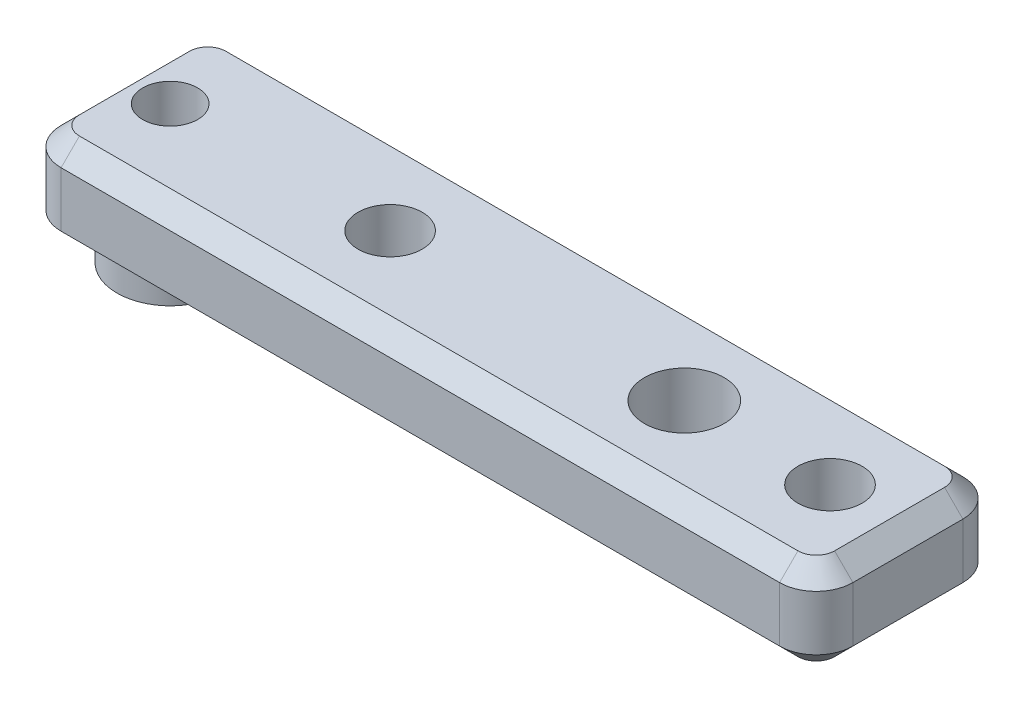
ISO-10303-21;
HEADER;
FILE_DESCRIPTION(('STEP AP214'),'2;1');
FILE_NAME('part.step','',(''),(''),'','','');
FILE_SCHEMA(('AUTOMOTIVE_DESIGN { 1 0 10303 214 1 1 1 1 }'));
ENDSEC;
DATA;
#1=APPLICATION_CONTEXT('core data for automotive mechanical design processes');
#2=APPLICATION_PROTOCOL_DEFINITION('international standard','automotive_design',2000,#1);
#3=PRODUCT_CONTEXT('',#1,'mechanical');
#4=PRODUCT('Part','Part','',(#3));
#5=PRODUCT_RELATED_PRODUCT_CATEGORY('part','',(#4));
#6=PRODUCT_DEFINITION_FORMATION('','',#4);
#7=PRODUCT_DEFINITION_CONTEXT('part definition',#1,'design');
#8=PRODUCT_DEFINITION('design','',#6,#7);
#9=PRODUCT_DEFINITION_SHAPE('','',#8);
#10=(LENGTH_UNIT() NAMED_UNIT(*) SI_UNIT(.MILLI.,.METRE.));
#11=(NAMED_UNIT(*) PLANE_ANGLE_UNIT() SI_UNIT($,.RADIAN.));
#12=(NAMED_UNIT(*) SI_UNIT($,.STERADIAN.) SOLID_ANGLE_UNIT());
#13=UNCERTAINTY_MEASURE_WITH_UNIT(LENGTH_MEASURE(1.E-05),#10,'distance_accuracy_value','');
#14=(GEOMETRIC_REPRESENTATION_CONTEXT(3) GLOBAL_UNCERTAINTY_ASSIGNED_CONTEXT((#13)) GLOBAL_UNIT_ASSIGNED_CONTEXT((#10,
#11,#12)) REPRESENTATION_CONTEXT('',''));
#15=CARTESIAN_POINT('',(0.,0.,0.));
#16=DIRECTION('',(0.,0.,1.));
#17=DIRECTION('',(1.,0.,0.));
#18=AXIS2_PLACEMENT_3D('',#15,#16,#17);
#19=CARTESIAN_POINT('',(-27.,5.,-5.));
#20=DIRECTION('',(0.,0.,1.));
#21=DIRECTION('',(1.,0.,0.));
#22=AXIS2_PLACEMENT_3D('',#19,#20,#21);
#23=PLANE('',#22);
#24=DIRECTION('',(0.,1.,0.));
#25=VECTOR('',#24,1.);
#26=CARTESIAN_POINT('',(14.2,5.,-5.));
#27=LINE('',#26,#25);
#28=CARTESIAN_POINT('',(14.2,4.,-5.));
#29=VERTEX_POINT('',#28);
#30=CARTESIAN_POINT('',(14.2,1.00000000000001,-5.));
#31=VERTEX_POINT('',#30);
#32=EDGE_CURVE('E187',#29,#31,#27,.F.);
#33=ORIENTED_EDGE('',*,*,#32,.T.);
#34=DIRECTION('',(-1.,0.,0.));
#35=VECTOR('',#34,1.);
#36=CARTESIAN_POINT('',(-27.,1.00000000000001,-5.));
#37=LINE('',#36,#35);
#38=CARTESIAN_POINT('',(-25.,1.00000000000001,-5.));
#39=VERTEX_POINT('',#38);
#40=EDGE_CURVE('E188',#31,#39,#37,.T.);
#41=ORIENTED_EDGE('',*,*,#40,.T.);
#42=DIRECTION('',(0.,-1.,0.));
#43=VECTOR('',#42,1.);
#44=CARTESIAN_POINT('',(-25.,5.,-5.));
#45=LINE('',#44,#43);
#46=CARTESIAN_POINT('',(-25.,4.,-5.));
#47=VERTEX_POINT('',#46);
#48=EDGE_CURVE('E186',#39,#47,#45,.F.);
#49=ORIENTED_EDGE('',*,*,#48,.T.);
#50=DIRECTION('',(1.,0.,0.));
#51=VECTOR('',#50,1.);
#52=CARTESIAN_POINT('',(14.2,4.,-5.));
#53=LINE('',#52,#51);
#54=EDGE_CURVE('E168',#47,#29,#53,.T.);
#55=ORIENTED_EDGE('',*,*,#54,.T.);
#56=EDGE_LOOP('',(#33,#41,#49,#55));
#57=FACE_BOUND('',#56,.T.);
#58=ADVANCED_FACE('F41',(#57),#23,.F.);
#59=CARTESIAN_POINT('',(-27.,5.,-5.));
#60=DIRECTION('',(1.,0.,0.));
#61=DIRECTION('',(0.,0.,-1.));
#62=AXIS2_PLACEMENT_3D('',#59,#60,#61);
#63=PLANE('',#62);
#64=DIRECTION('',(0.,-1.,0.));
#65=VECTOR('',#64,1.);
#66=CARTESIAN_POINT('',(-27.,5.,-3.));
#67=LINE('',#66,#65);
#68=CARTESIAN_POINT('',(-27.,4.,-3.));
#69=VERTEX_POINT('',#68);
#70=CARTESIAN_POINT('',(-27.,1.00000000000001,-3.));
#71=VERTEX_POINT('',#70);
#72=EDGE_CURVE('E324',#69,#71,#67,.T.);
#73=ORIENTED_EDGE('',*,*,#72,.T.);
#74=DIRECTION('',(0.,0.,1.));
#75=VECTOR('',#74,1.);
#76=CARTESIAN_POINT('',(-27.,1.00000000000001,-5.));
#77=LINE('',#76,#75);
#78=CARTESIAN_POINT('',(-27.,1.00000000000001,3.));
#79=VERTEX_POINT('',#78);
#80=EDGE_CURVE('E230',#71,#79,#77,.T.);
#81=ORIENTED_EDGE('',*,*,#80,.T.);
#82=DIRECTION('',(0.,-1.,0.));
#83=VECTOR('',#82,1.);
#84=CARTESIAN_POINT('',(-27.,5.,3.));
#85=LINE('',#84,#83);
#86=CARTESIAN_POINT('',(-27.,4.,3.));
#87=VERTEX_POINT('',#86);
#88=EDGE_CURVE('E329',#79,#87,#85,.F.);
#89=ORIENTED_EDGE('',*,*,#88,.T.);
#90=DIRECTION('',(0.,0.,-1.));
#91=VECTOR('',#90,1.);
#92=CARTESIAN_POINT('',(-27.,4.,-3.));
#93=LINE('',#92,#91);
#94=EDGE_CURVE('E227',#87,#69,#93,.T.);
#95=ORIENTED_EDGE('',*,*,#94,.T.);
#96=EDGE_LOOP('',(#73,#81,#89,#95));
#97=FACE_BOUND('',#96,.T.);
#98=ADVANCED_FACE('F403',(#97),#63,.F.);
#99=CARTESIAN_POINT('',(-27.,5.,5.));
#100=DIRECTION('',(0.,0.,-1.));
#101=DIRECTION('',(-1.,0.,0.));
#102=AXIS2_PLACEMENT_3D('',#99,#100,#101);
#103=PLANE('',#102);
#104=DIRECTION('',(0.,-1.,0.));
#105=VECTOR('',#104,1.);
#106=CARTESIAN_POINT('',(-25.,5.,5.));
#107=LINE('',#106,#105);
#108=CARTESIAN_POINT('',(-25.,4.,5.));
#109=VERTEX_POINT('',#108);
#110=CARTESIAN_POINT('',(-25.,1.00000000000001,5.));
#111=VERTEX_POINT('',#110);
#112=EDGE_CURVE('E312',#109,#111,#107,.T.);
#113=ORIENTED_EDGE('',*,*,#112,.T.);
#114=DIRECTION('',(1.,0.,0.));
#115=VECTOR('',#114,1.);
#116=CARTESIAN_POINT('',(-27.,1.00000000000001,5.));
#117=LINE('',#116,#115);
#118=CARTESIAN_POINT('',(14.2,1.00000000000001,5.));
#119=VERTEX_POINT('',#118);
#120=EDGE_CURVE('E244',#111,#119,#117,.T.);
#121=ORIENTED_EDGE('',*,*,#120,.T.);
#122=DIRECTION('',(0.,1.,0.));
#123=VECTOR('',#122,1.);
#124=CARTESIAN_POINT('',(14.2,5.,5.));
#125=LINE('',#124,#123);
#126=CARTESIAN_POINT('',(14.2,4.,5.));
#127=VERTEX_POINT('',#126);
#128=EDGE_CURVE('E193',#119,#127,#125,.T.);
#129=ORIENTED_EDGE('',*,*,#128,.T.);
#130=DIRECTION('',(-1.,0.,0.));
#131=VECTOR('',#130,1.);
#132=CARTESIAN_POINT('',(-25.,4.,5.));
#133=LINE('',#132,#131);
#134=EDGE_CURVE('E243',#127,#109,#133,.T.);
#135=ORIENTED_EDGE('',*,*,#134,.T.);
#136=EDGE_LOOP('',(#113,#121,#129,#135));
#137=FACE_BOUND('',#136,.T.);
#138=ADVANCED_FACE('F315',(#137),#103,.F.);
#139=CARTESIAN_POINT('',(0.,5.,0.));
#140=DIRECTION('',(0.,1.,0.));
#141=DIRECTION('',(0.,0.,1.));
#142=AXIS2_PLACEMENT_3D('',#139,#140,#141);
#143=PLANE('',#142);
#144=CARTESIAN_POINT('',(14.2,5.,-3.));
#145=DIRECTION('',(0.,1.,0.));
#146=DIRECTION('',(0.,0.,1.));
#147=AXIS2_PLACEMENT_3D('',#144,#145,#146);
#148=CIRCLE('',#147,0.999999999999999);
#149=CARTESIAN_POINT('',(15.2,5.,-3.));
#150=VERTEX_POINT('',#149);
#151=CARTESIAN_POINT('',(14.2,5.,-4.));
#152=VERTEX_POINT('',#151);
#153=EDGE_CURVE('E69',#150,#152,#148,.T.);
#154=ORIENTED_EDGE('',*,*,#153,.T.);
#155=DIRECTION('',(-1.,0.,0.));
#156=VECTOR('',#155,1.);
#157=CARTESIAN_POINT('',(-25.,5.,-4.));
#158=LINE('',#157,#156);
#159=CARTESIAN_POINT('',(-25.,5.,-4.));
#160=VERTEX_POINT('',#159);
#161=EDGE_CURVE('E51',#152,#160,#158,.T.);
#162=ORIENTED_EDGE('',*,*,#161,.T.);
#163=CARTESIAN_POINT('',(-25.,5.,-3.));
#164=DIRECTION('',(0.,1.,0.));
#165=DIRECTION('',(0.,0.,1.));
#166=AXIS2_PLACEMENT_3D('',#163,#164,#165);
#167=CIRCLE('',#166,0.999999999999997);
#168=CARTESIAN_POINT('',(-26.,5.,-3.));
#169=VERTEX_POINT('',#168);
#170=EDGE_CURVE('E257',#160,#169,#167,.T.);
#171=ORIENTED_EDGE('',*,*,#170,.T.);
#172=DIRECTION('',(0.,0.,1.));
#173=VECTOR('',#172,1.);
#174=CARTESIAN_POINT('',(-26.,5.,3.));
#175=LINE('',#174,#173);
#176=CARTESIAN_POINT('',(-26.,5.,3.));
#177=VERTEX_POINT('',#176);
#178=EDGE_CURVE('E253',#169,#177,#175,.T.);
#179=ORIENTED_EDGE('',*,*,#178,.T.);
#180=CARTESIAN_POINT('',(-25.,5.,3.));
#181=DIRECTION('',(0.,1.,0.));
#182=DIRECTION('',(0.,0.,1.));
#183=AXIS2_PLACEMENT_3D('',#180,#181,#182);
#184=CIRCLE('',#183,0.999999999999997);
#185=CARTESIAN_POINT('',(-25.,5.,4.));
#186=VERTEX_POINT('',#185);
#187=EDGE_CURVE('E252',#177,#186,#184,.T.);
#188=ORIENTED_EDGE('',*,*,#187,.T.);
#189=DIRECTION('',(1.,0.,0.));
#190=VECTOR('',#189,1.);
#191=CARTESIAN_POINT('',(14.2,5.,4.));
#192=LINE('',#191,#190);
#193=CARTESIAN_POINT('',(14.2,5.,4.));
#194=VERTEX_POINT('',#193);
#195=EDGE_CURVE('E250',#186,#194,#192,.T.);
#196=ORIENTED_EDGE('',*,*,#195,.T.);
#197=CARTESIAN_POINT('',(14.2,5.,3.));
#198=DIRECTION('',(0.,1.,0.));
#199=DIRECTION('',(0.,0.,1.));
#200=AXIS2_PLACEMENT_3D('',#197,#198,#199);
#201=CIRCLE('',#200,0.999999999999999);
#202=CARTESIAN_POINT('',(15.2,5.,3.));
#203=VERTEX_POINT('',#202);
#204=EDGE_CURVE('E248',#194,#203,#201,.T.);
#205=ORIENTED_EDGE('',*,*,#204,.T.);
#206=DIRECTION('',(0.,0.,-1.));
#207=VECTOR('',#206,1.);
#208=CARTESIAN_POINT('',(15.2,5.,-3.));
#209=LINE('',#208,#207);
#210=EDGE_CURVE('E254',#203,#150,#209,.T.);
#211=ORIENTED_EDGE('',*,*,#210,.T.);
#212=EDGE_LOOP('',(#154,#162,#171,#179,#188,#196,#205,#211));
#213=FACE_BOUND('',#212,.T.);
#214=CARTESIAN_POINT('',(-24.05,5.,0.));
#215=DIRECTION('',(0.,1.,0.));
#216=DIRECTION('',(0.,0.,1.));
#217=AXIS2_PLACEMENT_3D('',#214,#215,#216);
#218=CIRCLE('',#217,1.5);
#219=CARTESIAN_POINT('',(-24.05,5.,1.5));
#220=VERTEX_POINT('',#219);
#221=EDGE_CURVE('E369',#220,#220,#218,.T.);
#222=ORIENTED_EDGE('',*,*,#221,.F.);
#223=EDGE_LOOP('',(#222));
#224=FACE_BOUND('',#223,.T.);
#225=CARTESIAN_POINT('',(4.,5.,0.));
#226=DIRECTION('',(0.,1.,0.));
#227=DIRECTION('',(0.,0.,1.));
#228=AXIS2_PLACEMENT_3D('',#225,#226,#227);
#229=CIRCLE('',#228,2.175);
#230=CARTESIAN_POINT('',(4.,5.,2.175));
#231=VERTEX_POINT('',#230);
#232=EDGE_CURVE('E377',#231,#231,#229,.T.);
#233=ORIENTED_EDGE('',*,*,#232,.F.);
#234=EDGE_LOOP('',(#233));
#235=FACE_BOUND('',#234,.T.);
#236=CARTESIAN_POINT('',(-12.05,5.,0.));
#237=DIRECTION('',(0.,1.,0.));
#238=DIRECTION('',(0.,0.,1.));
#239=AXIS2_PLACEMENT_3D('',#236,#237,#238);
#240=CIRCLE('',#239,1.75);
#241=CARTESIAN_POINT('',(-12.05,5.,1.75));
#242=VERTEX_POINT('',#241);
#243=EDGE_CURVE('E372',#242,#242,#240,.T.);
#244=ORIENTED_EDGE('',*,*,#243,.F.);
#245=EDGE_LOOP('',(#244));
#246=FACE_BOUND('',#245,.T.);
#247=CARTESIAN_POINT('',(11.95,5.,0.));
#248=DIRECTION('',(0.,1.,0.));
#249=DIRECTION('',(0.,0.,1.));
#250=AXIS2_PLACEMENT_3D('',#247,#248,#249);
#251=CIRCLE('',#250,1.75);
#252=CARTESIAN_POINT('',(11.95,5.,1.75));
#253=VERTEX_POINT('',#252);
#254=EDGE_CURVE('E371',#253,#253,#251,.T.);
#255=ORIENTED_EDGE('',*,*,#254,.F.);
#256=EDGE_LOOP('',(#255));
#257=FACE_BOUND('',#256,.T.);
#258=ADVANCED_FACE('F600',(#213,#224,#235,#246,#257),#143,.T.);
#259=CARTESIAN_POINT('',(0.,0.,0.));
#260=DIRECTION('',(0.,1.,0.));
#261=DIRECTION('',(0.,0.,1.));
#262=AXIS2_PLACEMENT_3D('',#259,#260,#261);
#263=PLANE('',#262);
#264=CARTESIAN_POINT('',(-24.05,0.,0.));
#265=DIRECTION('',(0.,-1.,0.));
#266=DIRECTION('',(0.,0.,-1.));
#267=AXIS2_PLACEMENT_3D('',#264,#265,#266);
#268=CIRCLE('',#267,2.9);
#269=CARTESIAN_POINT('',(-26.,0.,-2.14650879336658));
#270=VERTEX_POINT('',#269);
#271=CARTESIAN_POINT('',(-26.,0.,2.14650879336658));
#272=VERTEX_POINT('',#271);
#273=EDGE_CURVE('E323',#270,#272,#268,.T.);
#274=ORIENTED_EDGE('',*,*,#273,.F.);
#275=DIRECTION('',(0.,0.,-1.));
#276=VECTOR('',#275,1.);
#277=CARTESIAN_POINT('',(-26.,0.,0.));
#278=LINE('',#277,#276);
#279=CARTESIAN_POINT('',(-26.,0.,-3.));
#280=VERTEX_POINT('',#279);
#281=EDGE_CURVE('E223',#270,#280,#278,.T.);
#282=ORIENTED_EDGE('',*,*,#281,.T.);
#283=CARTESIAN_POINT('',(-25.,0.,-3.));
#284=DIRECTION('',(0.,1.,0.));
#285=DIRECTION('',(0.,0.,1.));
#286=AXIS2_PLACEMENT_3D('',#283,#284,#285);
#287=CIRCLE('',#286,0.999999999999992);
#288=CARTESIAN_POINT('',(-25.,0.,-3.99999999999999));
#289=VERTEX_POINT('',#288);
#290=EDGE_CURVE('E220',#280,#289,#287,.F.);
#291=ORIENTED_EDGE('',*,*,#290,.T.);
#292=DIRECTION('',(1.,0.,0.));
#293=VECTOR('',#292,1.);
#294=CARTESIAN_POINT('',(0.,0.,-3.99999999999999));
#295=LINE('',#294,#293);
#296=CARTESIAN_POINT('',(14.2,0.,-3.99999999999999));
#297=VERTEX_POINT('',#296);
#298=EDGE_CURVE('E218',#289,#297,#295,.T.);
#299=ORIENTED_EDGE('',*,*,#298,.T.);
#300=CARTESIAN_POINT('',(14.2,0.,-3.));
#301=DIRECTION('',(0.,1.,0.));
#302=DIRECTION('',(0.,0.,1.));
#303=AXIS2_PLACEMENT_3D('',#300,#301,#302);
#304=CIRCLE('',#303,0.999999999999992);
#305=CARTESIAN_POINT('',(15.2,0.,-3.));
#306=VERTEX_POINT('',#305);
#307=EDGE_CURVE('E215',#297,#306,#304,.F.);
#308=ORIENTED_EDGE('',*,*,#307,.T.);
#309=DIRECTION('',(0.,0.,1.));
#310=VECTOR('',#309,1.);
#311=CARTESIAN_POINT('',(15.2,0.,0.));
#312=LINE('',#311,#310);
#313=CARTESIAN_POINT('',(15.2,0.,3.));
#314=VERTEX_POINT('',#313);
#315=EDGE_CURVE('E208',#306,#314,#312,.T.);
#316=ORIENTED_EDGE('',*,*,#315,.T.);
#317=CARTESIAN_POINT('',(14.2,0.,3.));
#318=DIRECTION('',(0.,1.,0.));
#319=DIRECTION('',(0.,0.,1.));
#320=AXIS2_PLACEMENT_3D('',#317,#318,#319);
#321=CIRCLE('',#320,0.999999999999992);
#322=CARTESIAN_POINT('',(14.2,0.,3.99999999999999));
#323=VERTEX_POINT('',#322);
#324=EDGE_CURVE('E207',#314,#323,#321,.F.);
#325=ORIENTED_EDGE('',*,*,#324,.T.);
#326=DIRECTION('',(-1.,0.,0.));
#327=VECTOR('',#326,1.);
#328=CARTESIAN_POINT('',(0.,0.,3.99999999999999));
#329=LINE('',#328,#327);
#330=CARTESIAN_POINT('',(-25.,0.,3.99999999999999));
#331=VERTEX_POINT('',#330);
#332=EDGE_CURVE('E204',#323,#331,#329,.T.);
#333=ORIENTED_EDGE('',*,*,#332,.T.);
#334=CARTESIAN_POINT('',(-25.,0.,3.));
#335=DIRECTION('',(0.,1.,0.));
#336=DIRECTION('',(0.,0.,1.));
#337=AXIS2_PLACEMENT_3D('',#334,#335,#336);
#338=CIRCLE('',#337,0.99999999999999);
#339=CARTESIAN_POINT('',(-26.,0.,3.));
#340=VERTEX_POINT('',#339);
#341=EDGE_CURVE('E206',#331,#340,#338,.F.);
#342=ORIENTED_EDGE('',*,*,#341,.T.);
#343=DIRECTION('',(0.,0.,-1.));
#344=VECTOR('',#343,1.);
#345=CARTESIAN_POINT('',(-26.,0.,0.));
#346=LINE('',#345,#344);
#347=EDGE_CURVE('E214',#340,#272,#346,.T.);
#348=ORIENTED_EDGE('',*,*,#347,.T.);
#349=EDGE_LOOP('',(#274,#282,#291,#299,#308,#316,#325,#333,#342,#348));
#350=FACE_BOUND('',#349,.T.);
#351=CARTESIAN_POINT('',(4.,0.,0.));
#352=DIRECTION('',(0.,1.,0.));
#353=DIRECTION('',(0.,0.,1.));
#354=AXIS2_PLACEMENT_3D('',#351,#352,#353);
#355=CIRCLE('',#354,2.175);
#356=CARTESIAN_POINT('',(4.,0.,2.175));
#357=VERTEX_POINT('',#356);
#358=EDGE_CURVE('E360',#357,#357,#355,.T.);
#359=ORIENTED_EDGE('',*,*,#358,.T.);
#360=EDGE_LOOP('',(#359));
#361=FACE_BOUND('',#360,.T.);
#362=CARTESIAN_POINT('',(-12.05,0.,0.));
#363=DIRECTION('',(0.,1.,0.));
#364=DIRECTION('',(0.,0.,1.));
#365=AXIS2_PLACEMENT_3D('',#362,#363,#364);
#366=CIRCLE('',#365,1.75);
#367=CARTESIAN_POINT('',(-12.05,0.,1.75));
#368=VERTEX_POINT('',#367);
#369=EDGE_CURVE('E365',#368,#368,#366,.T.);
#370=ORIENTED_EDGE('',*,*,#369,.T.);
#371=EDGE_LOOP('',(#370));
#372=FACE_BOUND('',#371,.T.);
#373=CARTESIAN_POINT('',(11.95,0.,0.));
#374=DIRECTION('',(0.,1.,0.));
#375=DIRECTION('',(0.,0.,1.));
#376=AXIS2_PLACEMENT_3D('',#373,#374,#375);
#377=CIRCLE('',#376,1.75);
#378=CARTESIAN_POINT('',(11.95,0.,1.75));
#379=VERTEX_POINT('',#378);
#380=EDGE_CURVE('E370',#379,#379,#377,.T.);
#381=ORIENTED_EDGE('',*,*,#380,.T.);
#382=EDGE_LOOP('',(#381));
#383=FACE_BOUND('',#382,.T.);
#384=ADVANCED_FACE('F595',(#350,#361,#372,#383),#263,.F.);
#385=CARTESIAN_POINT('',(11.95,-2.,0.));
#386=DIRECTION('',(0.,1.,0.));
#387=DIRECTION('',(0.,0.,1.));
#388=AXIS2_PLACEMENT_3D('',#385,#386,#387);
#389=CYLINDRICAL_SURFACE('',#388,1.75);
#390=ORIENTED_EDGE('',*,*,#254,.T.);
#391=EDGE_LOOP('',(#390));
#392=FACE_BOUND('',#391,.T.);
#393=ORIENTED_EDGE('',*,*,#380,.F.);
#394=EDGE_LOOP('',(#393));
#395=FACE_BOUND('',#394,.T.);
#396=ADVANCED_FACE('F597',(#392,#395),#389,.F.);
#397=CARTESIAN_POINT('',(-12.05,-2.,0.));
#398=DIRECTION('',(0.,1.,0.));
#399=DIRECTION('',(0.,0.,1.));
#400=AXIS2_PLACEMENT_3D('',#397,#398,#399);
#401=CYLINDRICAL_SURFACE('',#400,1.75);
#402=ORIENTED_EDGE('',*,*,#243,.T.);
#403=EDGE_LOOP('',(#402));
#404=FACE_BOUND('',#403,.T.);
#405=ORIENTED_EDGE('',*,*,#369,.F.);
#406=EDGE_LOOP('',(#405));
#407=FACE_BOUND('',#406,.T.);
#408=ADVANCED_FACE('F627',(#404,#407),#401,.F.);
#409=CARTESIAN_POINT('',(4.,-2.,0.));
#410=DIRECTION('',(0.,1.,0.));
#411=DIRECTION('',(0.,0.,1.));
#412=AXIS2_PLACEMENT_3D('',#409,#410,#411);
#413=CYLINDRICAL_SURFACE('',#412,2.175);
#414=ORIENTED_EDGE('',*,*,#232,.T.);
#415=EDGE_LOOP('',(#414));
#416=FACE_BOUND('',#415,.T.);
#417=ORIENTED_EDGE('',*,*,#358,.F.);
#418=EDGE_LOOP('',(#417));
#419=FACE_BOUND('',#418,.T.);
#420=ADVANCED_FACE('F637',(#416,#419),#413,.F.);
#421=CARTESIAN_POINT('',(-24.05,-2.,0.));
#422=DIRECTION('',(0.,1.,0.));
#423=DIRECTION('',(0.,0.,1.));
#424=AXIS2_PLACEMENT_3D('',#421,#422,#423);
#425=CYLINDRICAL_SURFACE('',#424,1.5);
#426=ORIENTED_EDGE('',*,*,#221,.T.);
#427=EDGE_LOOP('',(#426));
#428=FACE_BOUND('',#427,.T.);
#429=CARTESIAN_POINT('',(-24.05,-2.5,0.));
#430=DIRECTION('',(0.,-1.,0.));
#431=DIRECTION('',(0.,0.,-1.));
#432=AXIS2_PLACEMENT_3D('',#429,#430,#431);
#433=CIRCLE('',#432,1.5);
#434=CARTESIAN_POINT('',(-24.05,-2.5,-1.5));
#435=VERTEX_POINT('',#434);
#436=EDGE_CURVE('E282',#435,#435,#433,.T.);
#437=ORIENTED_EDGE('',*,*,#436,.T.);
#438=EDGE_LOOP('',(#437));
#439=FACE_BOUND('',#438,.T.);
#440=ADVANCED_FACE('F387',(#428,#439),#425,.F.);
#441=CARTESIAN_POINT('',(-25.,5.,-3.));
#442=DIRECTION('',(0.,-1.,0.));
#443=DIRECTION('',(0.,0.,-1.));
#444=AXIS2_PLACEMENT_3D('',#441,#442,#443);
#445=CYLINDRICAL_SURFACE('',#444,2.);
#446=ORIENTED_EDGE('',*,*,#48,.F.);
#447=CARTESIAN_POINT('',(-25.,1.00000000000001,-3.));
#448=DIRECTION('',(0.,1.,0.));
#449=DIRECTION('',(0.,0.,1.));
#450=AXIS2_PLACEMENT_3D('',#447,#448,#449);
#451=CIRCLE('',#450,2.);
#452=EDGE_CURVE('E179',#39,#71,#451,.T.);
#453=ORIENTED_EDGE('',*,*,#452,.T.);
#454=ORIENTED_EDGE('',*,*,#72,.F.);
#455=CARTESIAN_POINT('',(-25.,4.,-3.));
#456=DIRECTION('',(0.,1.,0.));
#457=DIRECTION('',(0.,0.,1.));
#458=AXIS2_PLACEMENT_3D('',#455,#456,#457);
#459=CIRCLE('',#458,2.);
#460=EDGE_CURVE('E221',#69,#47,#459,.F.);
#461=ORIENTED_EDGE('',*,*,#460,.T.);
#462=EDGE_LOOP('',(#446,#453,#454,#461));
#463=FACE_BOUND('',#462,.T.);
#464=ADVANCED_FACE('F358',(#463),#445,.T.);
#465=CARTESIAN_POINT('',(-25.,5.,3.));
#466=DIRECTION('',(0.,-1.,0.));
#467=DIRECTION('',(0.,0.,-1.));
#468=AXIS2_PLACEMENT_3D('',#465,#466,#467);
#469=CYLINDRICAL_SURFACE('',#468,2.);
#470=ORIENTED_EDGE('',*,*,#88,.F.);
#471=CARTESIAN_POINT('',(-25.,1.00000000000001,3.));
#472=DIRECTION('',(0.,1.,0.));
#473=DIRECTION('',(0.,0.,1.));
#474=AXIS2_PLACEMENT_3D('',#471,#472,#473);
#475=CIRCLE('',#474,2.);
#476=EDGE_CURVE('E240',#79,#111,#475,.T.);
#477=ORIENTED_EDGE('',*,*,#476,.T.);
#478=ORIENTED_EDGE('',*,*,#112,.F.);
#479=CARTESIAN_POINT('',(-25.,4.,3.));
#480=DIRECTION('',(0.,1.,0.));
#481=DIRECTION('',(0.,0.,1.));
#482=AXIS2_PLACEMENT_3D('',#479,#480,#481);
#483=CIRCLE('',#482,2.);
#484=EDGE_CURVE('E232',#109,#87,#483,.F.);
#485=ORIENTED_EDGE('',*,*,#484,.T.);
#486=EDGE_LOOP('',(#470,#477,#478,#485));
#487=FACE_BOUND('',#486,.T.);
#488=ADVANCED_FACE('F319',(#487),#469,.T.);
#489=CARTESIAN_POINT('',(-24.05,-2.5,0.));
#490=DIRECTION('',(0.,-1.,0.));
#491=DIRECTION('',(0.,0.,-1.));
#492=AXIS2_PLACEMENT_3D('',#489,#490,#491);
#493=PLANE('',#492);
#494=CARTESIAN_POINT('',(-24.05,-2.5,0.));
#495=DIRECTION('',(0.,-1.,0.));
#496=DIRECTION('',(0.,0.,-1.));
#497=AXIS2_PLACEMENT_3D('',#494,#495,#496);
#498=CIRCLE('',#497,2.9);
#499=CARTESIAN_POINT('',(-24.05,-2.5,-2.9));
#500=VERTEX_POINT('',#499);
#501=EDGE_CURVE('E374',#500,#500,#498,.T.);
#502=ORIENTED_EDGE('',*,*,#501,.T.);
#503=EDGE_LOOP('',(#502));
#504=FACE_BOUND('',#503,.T.);
#505=ORIENTED_EDGE('',*,*,#436,.F.);
#506=EDGE_LOOP('',(#505));
#507=FACE_BOUND('',#506,.T.);
#508=ADVANCED_FACE('F386',(#504,#507),#493,.T.);
#509=CARTESIAN_POINT('',(-24.05,-2.5,0.));
#510=DIRECTION('',(0.,1.,0.));
#511=DIRECTION('',(0.,0.,1.));
#512=AXIS2_PLACEMENT_3D('',#509,#510,#511);
#513=CYLINDRICAL_SURFACE('',#512,2.9);
#514=ORIENTED_EDGE('',*,*,#501,.F.);
#515=EDGE_LOOP('',(#514));
#516=FACE_BOUND('',#515,.T.);
#517=ORIENTED_EDGE('',*,*,#273,.T.);
#518=CARTESIAN_POINT('',(-24.05,-1.94999999999998,0.));
#519=DIRECTION('',(0.707106781186547,0.707106781186547,0.));
#520=DIRECTION('',(-0.707106781186548,0.707106781186548,0.));
#521=AXIS2_PLACEMENT_3D('',#518,#519,#520);
#522=ELLIPSE('',#521,4.10121933088198,2.9);
#523=EDGE_CURVE('E11',#272,#270,#522,.F.);
#524=ORIENTED_EDGE('',*,*,#523,.T.);
#525=EDGE_LOOP('',(#517,#524));
#526=FACE_BOUND('',#525,.T.);
#527=ADVANCED_FACE('F394',(#516,#526),#513,.T.);
#528=CARTESIAN_POINT('',(16.2,-5.,-5.));
#529=DIRECTION('',(-1.,0.,0.));
#530=DIRECTION('',(0.,0.,1.));
#531=AXIS2_PLACEMENT_3D('',#528,#529,#530);
#532=PLANE('',#531);
#533=DIRECTION('',(0.,1.,0.));
#534=VECTOR('',#533,1.);
#535=CARTESIAN_POINT('',(16.2,-5.,3.));
#536=LINE('',#535,#534);
#537=CARTESIAN_POINT('',(16.2,4.,3.));
#538=VERTEX_POINT('',#537);
#539=CARTESIAN_POINT('',(16.2,1.00000000000001,3.));
#540=VERTEX_POINT('',#539);
#541=EDGE_CURVE('E200',#538,#540,#536,.F.);
#542=ORIENTED_EDGE('',*,*,#541,.T.);
#543=DIRECTION('',(0.,0.,-1.));
#544=VECTOR('',#543,1.);
#545=CARTESIAN_POINT('',(16.2,1.00000000000001,-5.));
#546=LINE('',#545,#544);
#547=CARTESIAN_POINT('',(16.2,1.00000000000001,-3.));
#548=VERTEX_POINT('',#547);
#549=EDGE_CURVE('E231',#540,#548,#546,.T.);
#550=ORIENTED_EDGE('',*,*,#549,.T.);
#551=DIRECTION('',(0.,1.,0.));
#552=VECTOR('',#551,1.);
#553=CARTESIAN_POINT('',(16.2,-5.,-3.));
#554=LINE('',#553,#552);
#555=CARTESIAN_POINT('',(16.2,4.,-3.));
#556=VERTEX_POINT('',#555);
#557=EDGE_CURVE('E191',#548,#556,#554,.T.);
#558=ORIENTED_EDGE('',*,*,#557,.T.);
#559=DIRECTION('',(0.,0.,1.));
#560=VECTOR('',#559,1.);
#561=CARTESIAN_POINT('',(16.2,4.,3.));
#562=LINE('',#561,#560);
#563=EDGE_CURVE('E233',#556,#538,#562,.T.);
#564=ORIENTED_EDGE('',*,*,#563,.T.);
#565=EDGE_LOOP('',(#542,#550,#558,#564));
#566=FACE_BOUND('',#565,.T.);
#567=ADVANCED_FACE('F334',(#566),#532,.F.);
#568=CARTESIAN_POINT('',(14.2,-5.,-3.));
#569=DIRECTION('',(0.,1.,0.));
#570=DIRECTION('',(0.,0.,1.));
#571=AXIS2_PLACEMENT_3D('',#568,#569,#570);
#572=CYLINDRICAL_SURFACE('',#571,2.);
#573=ORIENTED_EDGE('',*,*,#557,.F.);
#574=CARTESIAN_POINT('',(14.2,1.00000000000001,-3.));
#575=DIRECTION('',(0.,1.,0.));
#576=DIRECTION('',(0.,0.,1.));
#577=AXIS2_PLACEMENT_3D('',#574,#575,#576);
#578=CIRCLE('',#577,2.);
#579=EDGE_CURVE('E177',#548,#31,#578,.T.);
#580=ORIENTED_EDGE('',*,*,#579,.T.);
#581=ORIENTED_EDGE('',*,*,#32,.F.);
#582=CARTESIAN_POINT('',(14.2,4.,-3.));
#583=DIRECTION('',(0.,1.,0.));
#584=DIRECTION('',(0.,0.,1.));
#585=AXIS2_PLACEMENT_3D('',#582,#583,#584);
#586=CIRCLE('',#585,2.);
#587=EDGE_CURVE('E171',#29,#556,#586,.F.);
#588=ORIENTED_EDGE('',*,*,#587,.T.);
#589=EDGE_LOOP('',(#573,#580,#581,#588));
#590=FACE_BOUND('',#589,.T.);
#591=ADVANCED_FACE('F192',(#590),#572,.T.);
#592=CARTESIAN_POINT('',(14.2,5.,3.));
#593=DIRECTION('',(0.,1.,0.));
#594=DIRECTION('',(0.,0.,1.));
#595=AXIS2_PLACEMENT_3D('',#592,#593,#594);
#596=CYLINDRICAL_SURFACE('',#595,2.);
#597=ORIENTED_EDGE('',*,*,#128,.F.);
#598=CARTESIAN_POINT('',(14.2,1.00000000000001,3.));
#599=DIRECTION('',(0.,1.,0.));
#600=DIRECTION('',(0.,0.,1.));
#601=AXIS2_PLACEMENT_3D('',#598,#599,#600);
#602=CIRCLE('',#601,2.);
#603=EDGE_CURVE('E241',#119,#540,#602,.T.);
#604=ORIENTED_EDGE('',*,*,#603,.T.);
#605=ORIENTED_EDGE('',*,*,#541,.F.);
#606=CARTESIAN_POINT('',(14.2,4.,3.));
#607=DIRECTION('',(0.,1.,0.));
#608=DIRECTION('',(0.,0.,1.));
#609=AXIS2_PLACEMENT_3D('',#606,#607,#608);
#610=CIRCLE('',#609,2.);
#611=EDGE_CURVE('E237',#538,#127,#610,.F.);
#612=ORIENTED_EDGE('',*,*,#611,.T.);
#613=EDGE_LOOP('',(#597,#604,#605,#612));
#614=FACE_BOUND('',#613,.T.);
#615=ADVANCED_FACE('F416',(#614),#596,.T.);
#616=CARTESIAN_POINT('',(-27.,1.00000000000001,5.));
#617=DIRECTION('',(0.,0.707106781186547,-0.707106781186547));
#618=DIRECTION('',(1.,0.,0.));
#619=AXIS2_PLACEMENT_3D('',#616,#617,#618);
#620=PLANE('',#619);
#621=DIRECTION('',(0.,0.707106781186547,0.707106781186547));
#622=VECTOR('',#621,1.);
#623=CARTESIAN_POINT('',(-25.,0.,3.99999999999999));
#624=LINE('',#623,#622);
#625=EDGE_CURVE('E279',#331,#111,#624,.T.);
#626=ORIENTED_EDGE('',*,*,#625,.F.);
#627=ORIENTED_EDGE('',*,*,#332,.F.);
#628=DIRECTION('',(0.,-0.707106781186547,-0.707106781186547));
#629=VECTOR('',#628,1.);
#630=CARTESIAN_POINT('',(14.2,1.00000000000001,5.));
#631=LINE('',#630,#629);
#632=EDGE_CURVE('E276',#119,#323,#631,.T.);
#633=ORIENTED_EDGE('',*,*,#632,.F.);
#634=ORIENTED_EDGE('',*,*,#120,.F.);
#635=EDGE_LOOP('',(#626,#627,#633,#634));
#636=FACE_BOUND('',#635,.T.);
#637=ADVANCED_FACE('F423',(#636),#620,.F.);
#638=CARTESIAN_POINT('',(14.2,0.,3.));
#639=DIRECTION('',(0.,1.,0.));
#640=DIRECTION('',(0.,0.,1.));
#641=AXIS2_PLACEMENT_3D('',#638,#639,#640);
#642=CONICAL_SURFACE('',#641,0.999999999999992,0.785398163397448);
#643=ORIENTED_EDGE('',*,*,#632,.T.);
#644=ORIENTED_EDGE('',*,*,#324,.F.);
#645=DIRECTION('',(-0.707106781186547,-0.707106781186548,0.));
#646=VECTOR('',#645,1.);
#647=CARTESIAN_POINT('',(16.2,1.00000000000001,3.));
#648=LINE('',#647,#646);
#649=EDGE_CURVE('E274',#540,#314,#648,.T.);
#650=ORIENTED_EDGE('',*,*,#649,.F.);
#651=ORIENTED_EDGE('',*,*,#603,.F.);
#652=EDGE_LOOP('',(#643,#644,#650,#651));
#653=FACE_BOUND('',#652,.T.);
#654=ADVANCED_FACE('F343',(#653),#642,.T.);
#655=CARTESIAN_POINT('',(-25.,0.,3.));
#656=DIRECTION('',(0.,1.,0.));
#657=DIRECTION('',(0.,0.,1.));
#658=AXIS2_PLACEMENT_3D('',#655,#656,#657);
#659=CONICAL_SURFACE('',#658,0.99999999999999,0.785398163397449);
#660=ORIENTED_EDGE('',*,*,#625,.T.);
#661=ORIENTED_EDGE('',*,*,#476,.F.);
#662=DIRECTION('',(-0.707106781186547,0.707106781186547,0.));
#663=VECTOR('',#662,1.);
#664=CARTESIAN_POINT('',(-26.,0.,3.));
#665=LINE('',#664,#663);
#666=EDGE_CURVE('E272',#340,#79,#665,.T.);
#667=ORIENTED_EDGE('',*,*,#666,.F.);
#668=ORIENTED_EDGE('',*,*,#341,.F.);
#669=EDGE_LOOP('',(#660,#661,#667,#668));
#670=FACE_BOUND('',#669,.T.);
#671=ADVANCED_FACE('F454',(#670),#659,.T.);
#672=CARTESIAN_POINT('',(15.2,0.,0.));
#673=DIRECTION('',(-0.707106781186547,0.707106781186547,0.));
#674=DIRECTION('',(0.,0.,1.));
#675=AXIS2_PLACEMENT_3D('',#672,#673,#674);
#676=PLANE('',#675);
#677=ORIENTED_EDGE('',*,*,#649,.T.);
#678=ORIENTED_EDGE('',*,*,#315,.F.);
#679=DIRECTION('',(-0.707106781186547,-0.707106781186547,0.));
#680=VECTOR('',#679,1.);
#681=CARTESIAN_POINT('',(16.2,1.00000000000001,-3.));
#682=LINE('',#681,#680);
#683=EDGE_CURVE('E266',#548,#306,#682,.T.);
#684=ORIENTED_EDGE('',*,*,#683,.F.);
#685=ORIENTED_EDGE('',*,*,#549,.F.);
#686=EDGE_LOOP('',(#677,#678,#684,#685));
#687=FACE_BOUND('',#686,.T.);
#688=ADVANCED_FACE('F341',(#687),#676,.F.);
#689=CARTESIAN_POINT('',(-27.,1.00000000000001,-5.));
#690=DIRECTION('',(0.707106781186547,0.707106781186547,0.));
#691=DIRECTION('',(0.,0.,1.));
#692=AXIS2_PLACEMENT_3D('',#689,#690,#691);
#693=PLANE('',#692);
#694=ORIENTED_EDGE('',*,*,#666,.T.);
#695=ORIENTED_EDGE('',*,*,#80,.F.);
#696=DIRECTION('',(-0.707106781186547,0.707106781186547,0.));
#697=VECTOR('',#696,1.);
#698=CARTESIAN_POINT('',(-26.,0.,-3.));
#699=LINE('',#698,#697);
#700=EDGE_CURVE('E261',#280,#71,#699,.T.);
#701=ORIENTED_EDGE('',*,*,#700,.F.);
#702=ORIENTED_EDGE('',*,*,#281,.F.);
#703=ORIENTED_EDGE('',*,*,#523,.F.);
#704=ORIENTED_EDGE('',*,*,#347,.F.);
#705=EDGE_LOOP('',(#694,#695,#701,#702,#703,#704));
#706=FACE_BOUND('',#705,.T.);
#707=ADVANCED_FACE('F439',(#706),#693,.F.);
#708=CARTESIAN_POINT('',(14.2,0.,-3.));
#709=DIRECTION('',(0.,1.,0.));
#710=DIRECTION('',(0.,0.,1.));
#711=AXIS2_PLACEMENT_3D('',#708,#709,#710);
#712=CONICAL_SURFACE('',#711,0.999999999999992,0.785398163397448);
#713=ORIENTED_EDGE('',*,*,#683,.T.);
#714=ORIENTED_EDGE('',*,*,#307,.F.);
#715=DIRECTION('',(0.,-0.707106781186547,0.707106781186547));
#716=VECTOR('',#715,1.);
#717=CARTESIAN_POINT('',(14.2,1.00000000000001,-5.));
#718=LINE('',#717,#716);
#719=EDGE_CURVE('E262',#31,#297,#718,.T.);
#720=ORIENTED_EDGE('',*,*,#719,.F.);
#721=ORIENTED_EDGE('',*,*,#579,.F.);
#722=EDGE_LOOP('',(#713,#714,#720,#721));
#723=FACE_BOUND('',#722,.T.);
#724=ADVANCED_FACE('F347',(#723),#712,.T.);
#725=CARTESIAN_POINT('',(-25.,0.,-3.));
#726=DIRECTION('',(0.,1.,0.));
#727=DIRECTION('',(0.,0.,1.));
#728=AXIS2_PLACEMENT_3D('',#725,#726,#727);
#729=CONICAL_SURFACE('',#728,0.999999999999992,0.785398163397448);
#730=ORIENTED_EDGE('',*,*,#700,.T.);
#731=ORIENTED_EDGE('',*,*,#452,.F.);
#732=DIRECTION('',(0.,0.707106781186547,-0.707106781186547));
#733=VECTOR('',#732,1.);
#734=CARTESIAN_POINT('',(-25.,0.,-3.99999999999999));
#735=LINE('',#734,#733);
#736=EDGE_CURVE('E263',#289,#39,#735,.T.);
#737=ORIENTED_EDGE('',*,*,#736,.F.);
#738=ORIENTED_EDGE('',*,*,#290,.F.);
#739=EDGE_LOOP('',(#730,#731,#737,#738));
#740=FACE_BOUND('',#739,.T.);
#741=ADVANCED_FACE('F426',(#740),#729,.T.);
#742=CARTESIAN_POINT('',(-27.,1.00000000000001,-5.));
#743=DIRECTION('',(0.,0.707106781186547,0.707106781186547));
#744=DIRECTION('',(-1.,0.,0.));
#745=AXIS2_PLACEMENT_3D('',#742,#743,#744);
#746=PLANE('',#745);
#747=ORIENTED_EDGE('',*,*,#719,.T.);
#748=ORIENTED_EDGE('',*,*,#298,.F.);
#749=ORIENTED_EDGE('',*,*,#736,.T.);
#750=ORIENTED_EDGE('',*,*,#40,.F.);
#751=EDGE_LOOP('',(#747,#748,#749,#750));
#752=FACE_BOUND('',#751,.T.);
#753=ADVANCED_FACE('F355',(#752),#746,.F.);
#754=CARTESIAN_POINT('',(0.,5.,4.));
#755=DIRECTION('',(0.,0.707106781186547,0.707106781186547));
#756=DIRECTION('',(-1.,0.,0.));
#757=AXIS2_PLACEMENT_3D('',#754,#755,#756);
#758=PLANE('',#757);
#759=DIRECTION('',(0.,0.707106781186547,-0.707106781186547));
#760=VECTOR('',#759,1.);
#761=CARTESIAN_POINT('',(-25.,4.,5.));
#762=LINE('',#761,#760);
#763=EDGE_CURVE('E291',#109,#186,#762,.T.);
#764=ORIENTED_EDGE('',*,*,#763,.F.);
#765=ORIENTED_EDGE('',*,*,#134,.F.);
#766=DIRECTION('',(0.,-0.707106781186547,0.707106781186547));
#767=VECTOR('',#766,1.);
#768=CARTESIAN_POINT('',(14.2,5.,4.));
#769=LINE('',#768,#767);
#770=EDGE_CURVE('E46',#194,#127,#769,.T.);
#771=ORIENTED_EDGE('',*,*,#770,.F.);
#772=ORIENTED_EDGE('',*,*,#195,.F.);
#773=EDGE_LOOP('',(#764,#765,#771,#772));
#774=FACE_BOUND('',#773,.T.);
#775=ADVANCED_FACE('F42',(#774),#758,.T.);
#776=CARTESIAN_POINT('',(14.2,5.,3.));
#777=DIRECTION('',(0.,-1.,0.));
#778=DIRECTION('',(0.,0.,-1.));
#779=AXIS2_PLACEMENT_3D('',#776,#777,#778);
#780=CONICAL_SURFACE('',#779,0.999999999999999,0.785398163397448);
#781=ORIENTED_EDGE('',*,*,#770,.T.);
#782=ORIENTED_EDGE('',*,*,#611,.F.);
#783=DIRECTION('',(0.707106781186547,-0.707106781186548,0.));
#784=VECTOR('',#783,1.);
#785=CARTESIAN_POINT('',(15.2,5.,3.));
#786=LINE('',#785,#784);
#787=EDGE_CURVE('E293',#203,#538,#786,.T.);
#788=ORIENTED_EDGE('',*,*,#787,.F.);
#789=ORIENTED_EDGE('',*,*,#204,.F.);
#790=EDGE_LOOP('',(#781,#782,#788,#789));
#791=FACE_BOUND('',#790,.T.);
#792=ADVANCED_FACE('F302',(#791),#780,.T.);
#793=CARTESIAN_POINT('',(-25.,5.,3.));
#794=DIRECTION('',(0.,-1.,0.));
#795=DIRECTION('',(0.,0.,-1.));
#796=AXIS2_PLACEMENT_3D('',#793,#794,#795);
#797=CONICAL_SURFACE('',#796,0.999999999999997,0.785398163397449);
#798=ORIENTED_EDGE('',*,*,#763,.T.);
#799=ORIENTED_EDGE('',*,*,#187,.F.);
#800=DIRECTION('',(0.707106781186547,0.707106781186547,0.));
#801=VECTOR('',#800,1.);
#802=CARTESIAN_POINT('',(-27.,4.,3.));
#803=LINE('',#802,#801);
#804=EDGE_CURVE('E286',#87,#177,#803,.T.);
#805=ORIENTED_EDGE('',*,*,#804,.F.);
#806=ORIENTED_EDGE('',*,*,#484,.F.);
#807=EDGE_LOOP('',(#798,#799,#805,#806));
#808=FACE_BOUND('',#807,.T.);
#809=ADVANCED_FACE('F499',(#808),#797,.T.);
#810=CARTESIAN_POINT('',(16.2,4.,-5.));
#811=DIRECTION('',(0.707106781186547,0.707106781186547,0.));
#812=DIRECTION('',(0.,0.,-1.));
#813=AXIS2_PLACEMENT_3D('',#810,#811,#812);
#814=PLANE('',#813);
#815=ORIENTED_EDGE('',*,*,#787,.T.);
#816=ORIENTED_EDGE('',*,*,#563,.F.);
#817=DIRECTION('',(0.707106781186547,-0.707106781186547,0.));
#818=VECTOR('',#817,1.);
#819=CARTESIAN_POINT('',(15.2,5.,-3.));
#820=LINE('',#819,#818);
#821=EDGE_CURVE('E172',#150,#556,#820,.T.);
#822=ORIENTED_EDGE('',*,*,#821,.F.);
#823=ORIENTED_EDGE('',*,*,#210,.F.);
#824=EDGE_LOOP('',(#815,#816,#822,#823));
#825=FACE_BOUND('',#824,.T.);
#826=ADVANCED_FACE('F491',(#825),#814,.T.);
#827=CARTESIAN_POINT('',(-26.,5.,0.));
#828=DIRECTION('',(-0.707106781186547,0.707106781186547,0.));
#829=DIRECTION('',(0.,0.,-1.));
#830=AXIS2_PLACEMENT_3D('',#827,#828,#829);
#831=PLANE('',#830);
#832=ORIENTED_EDGE('',*,*,#804,.T.);
#833=ORIENTED_EDGE('',*,*,#178,.F.);
#834=DIRECTION('',(0.707106781186547,0.707106781186547,0.));
#835=VECTOR('',#834,1.);
#836=CARTESIAN_POINT('',(-27.,4.,-3.));
#837=LINE('',#836,#835);
#838=EDGE_CURVE('E166',#69,#169,#837,.T.);
#839=ORIENTED_EDGE('',*,*,#838,.F.);
#840=ORIENTED_EDGE('',*,*,#94,.F.);
#841=EDGE_LOOP('',(#832,#833,#839,#840));
#842=FACE_BOUND('',#841,.T.);
#843=ADVANCED_FACE('F487',(#842),#831,.T.);
#844=CARTESIAN_POINT('',(14.2,5.,-3.));
#845=DIRECTION('',(0.,-1.,0.));
#846=DIRECTION('',(0.,0.,-1.));
#847=AXIS2_PLACEMENT_3D('',#844,#845,#846);
#848=CONICAL_SURFACE('',#847,0.999999999999999,0.785398163397448);
#849=ORIENTED_EDGE('',*,*,#821,.T.);
#850=ORIENTED_EDGE('',*,*,#587,.F.);
#851=DIRECTION('',(0.,-0.707106781186547,-0.707106781186547));
#852=VECTOR('',#851,1.);
#853=CARTESIAN_POINT('',(14.2,5.,-4.));
#854=LINE('',#853,#852);
#855=EDGE_CURVE('E162',#152,#29,#854,.T.);
#856=ORIENTED_EDGE('',*,*,#855,.F.);
#857=ORIENTED_EDGE('',*,*,#153,.F.);
#858=EDGE_LOOP('',(#849,#850,#856,#857));
#859=FACE_BOUND('',#858,.T.);
#860=ADVANCED_FACE('F175',(#859),#848,.T.);
#861=CARTESIAN_POINT('',(-25.,5.,-3.));
#862=DIRECTION('',(0.,-1.,0.));
#863=DIRECTION('',(0.,0.,-1.));
#864=AXIS2_PLACEMENT_3D('',#861,#862,#863);
#865=CONICAL_SURFACE('',#864,0.999999999999999,0.785398163397448);
#866=ORIENTED_EDGE('',*,*,#838,.T.);
#867=ORIENTED_EDGE('',*,*,#170,.F.);
#868=DIRECTION('',(0.,0.707106781186547,0.707106781186548));
#869=VECTOR('',#868,1.);
#870=CARTESIAN_POINT('',(-25.,4.,-5.));
#871=LINE('',#870,#869);
#872=EDGE_CURVE('E56',#47,#160,#871,.T.);
#873=ORIENTED_EDGE('',*,*,#872,.F.);
#874=ORIENTED_EDGE('',*,*,#460,.F.);
#875=EDGE_LOOP('',(#866,#867,#873,#874));
#876=FACE_BOUND('',#875,.T.);
#877=ADVANCED_FACE('F471',(#876),#865,.T.);
#878=CARTESIAN_POINT('',(0.,5.,-4.));
#879=DIRECTION('',(0.,0.707106781186547,-0.707106781186547));
#880=DIRECTION('',(1.,0.,0.));
#881=AXIS2_PLACEMENT_3D('',#878,#879,#880);
#882=PLANE('',#881);
#883=ORIENTED_EDGE('',*,*,#855,.T.);
#884=ORIENTED_EDGE('',*,*,#54,.F.);
#885=ORIENTED_EDGE('',*,*,#872,.T.);
#886=ORIENTED_EDGE('',*,*,#161,.F.);
#887=EDGE_LOOP('',(#883,#884,#885,#886));
#888=FACE_BOUND('',#887,.T.);
#889=ADVANCED_FACE('F165',(#888),#882,.T.);
#890=CLOSED_SHELL('',(#58,#98,#138,#258,#384,#396,#408,#420,#440,#464,#488,#508,#527,#567,#591,
#615,#637,#654,#671,#688,#707,#724,#741,#753,#775,#792,#809,#826,#843,#860,#877,#889));
#891=MANIFOLD_SOLID_BREP('B2',#890);
#892=ADVANCED_BREP_SHAPE_REPRESENTATION('',(#18,#891),#14);
#893=SHAPE_DEFINITION_REPRESENTATION(#9,#892);
ENDSEC;
END-ISO-10303-21;
